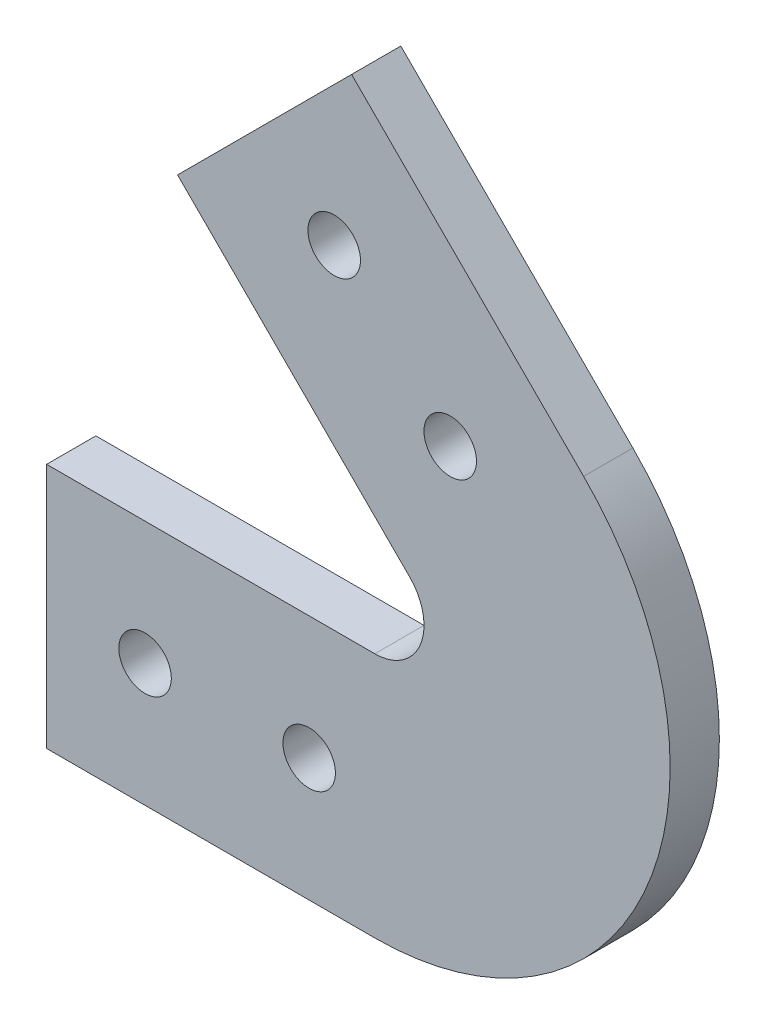
ISO-10303-21;
HEADER;
FILE_DESCRIPTION(('STEP AP214'),'2;1');
FILE_NAME('part.step','',(''),(''),'','','');
FILE_SCHEMA(('AUTOMOTIVE_DESIGN { 1 0 10303 214 1 1 1 1 }'));
ENDSEC;
DATA;
#1=APPLICATION_CONTEXT('core data for automotive mechanical design processes');
#2=APPLICATION_PROTOCOL_DEFINITION('international standard','automotive_design',2000,#1);
#3=PRODUCT_CONTEXT('',#1,'mechanical');
#4=PRODUCT('Part','Part','',(#3));
#5=PRODUCT_RELATED_PRODUCT_CATEGORY('part','',(#4));
#6=PRODUCT_DEFINITION_FORMATION('','',#4);
#7=PRODUCT_DEFINITION_CONTEXT('part definition',#1,'design');
#8=PRODUCT_DEFINITION('design','',#6,#7);
#9=PRODUCT_DEFINITION_SHAPE('','',#8);
#10=(LENGTH_UNIT() NAMED_UNIT(*) SI_UNIT(.MILLI.,.METRE.));
#11=(NAMED_UNIT(*) PLANE_ANGLE_UNIT() SI_UNIT($,.RADIAN.));
#12=(NAMED_UNIT(*) SI_UNIT($,.STERADIAN.) SOLID_ANGLE_UNIT());
#13=UNCERTAINTY_MEASURE_WITH_UNIT(LENGTH_MEASURE(1.E-05),#10,'distance_accuracy_value','');
#14=(GEOMETRIC_REPRESENTATION_CONTEXT(3) GLOBAL_UNCERTAINTY_ASSIGNED_CONTEXT((#13)) GLOBAL_UNIT_ASSIGNED_CONTEXT((#10,
#11,#12)) REPRESENTATION_CONTEXT('',''));
#15=CARTESIAN_POINT('',(0.,0.,0.));
#16=DIRECTION('',(0.,0.,1.));
#17=DIRECTION('',(1.,0.,0.));
#18=AXIS2_PLACEMENT_3D('',#15,#16,#17);
#19=CARTESIAN_POINT('',(134.30722902907,134.30722902907,3.));
#20=DIRECTION('',(0.707106781186548,0.707106781186547,0.));
#21=DIRECTION('',(-0.707106781186547,0.707106781186548,0.));
#22=AXIS2_PLACEMENT_3D('',#19,#20,#21);
#23=PLANE('',#22);
#24=DIRECTION('',(0.707106781186547,-0.707106781186548,0.));
#25=VECTOR('',#24,1.);
#26=CARTESIAN_POINT('',(134.30722902907,134.30722902907,0.));
#27=LINE('',#26,#25);
#28=CARTESIAN_POINT('',(62.11129919814,206.50315886,0.));
#29=VERTEX_POINT('',#28);
#30=CARTESIAN_POINT('',(76.2534348218709,192.361023236269,0.));
#31=VERTEX_POINT('',#30);
#32=EDGE_CURVE('E145',#29,#31,#27,.T.);
#33=ORIENTED_EDGE('',*,*,#32,.T.);
#34=DIRECTION('',(0.,0.,-1.));
#35=VECTOR('',#34,1.);
#36=CARTESIAN_POINT('',(76.2534348218709,192.361023236269,3.));
#37=LINE('',#36,#35);
#38=CARTESIAN_POINT('',(76.2534348218709,192.361023236269,3.));
#39=VERTEX_POINT('',#38);
#40=EDGE_CURVE('E13',#39,#31,#37,.T.);
#41=ORIENTED_EDGE('',*,*,#40,.F.);
#42=DIRECTION('',(0.707106781186547,-0.707106781186548,0.));
#43=VECTOR('',#42,1.);
#44=CARTESIAN_POINT('',(134.30722902907,134.30722902907,3.));
#45=LINE('',#44,#43);
#46=CARTESIAN_POINT('',(62.11129919814,206.50315886,3.));
#47=VERTEX_POINT('',#46);
#48=EDGE_CURVE('E165',#47,#39,#45,.T.);
#49=ORIENTED_EDGE('',*,*,#48,.F.);
#50=DIRECTION('',(0.,0.,-1.));
#51=VECTOR('',#50,1.);
#52=CARTESIAN_POINT('',(62.11129919814,206.50315886,3.));
#53=LINE('',#52,#51);
#54=EDGE_CURVE('E65',#47,#29,#53,.T.);
#55=ORIENTED_EDGE('',*,*,#54,.T.);
#56=EDGE_LOOP('',(#33,#41,#49,#55));
#57=FACE_BOUND('',#56,.T.);
#58=ADVANCED_FACE('F49',(#57),#23,.F.);
#59=CARTESIAN_POINT('',(74.1321144783115,190.239702892709,3.));
#60=DIRECTION('',(0.,0.,-1.));
#61=DIRECTION('',(-1.,0.,0.));
#62=AXIS2_PLACEMENT_3D('',#59,#60,#61);
#63=CYLINDRICAL_SURFACE('',#62,2.99999999999998);
#64=CARTESIAN_POINT('',(74.1321144783115,190.239702892709,0.));
#65=DIRECTION('',(0.,0.,1.));
#66=DIRECTION('',(1.,0.,0.));
#67=AXIS2_PLACEMENT_3D('',#64,#65,#66);
#68=CIRCLE('',#67,2.99999999999998);
#69=CARTESIAN_POINT('',(74.1321144783115,187.239702892709,0.));
#70=VERTEX_POINT('',#69);
#71=EDGE_CURVE('E147',#31,#70,#68,.F.);
#72=ORIENTED_EDGE('',*,*,#71,.T.);
#73=DIRECTION('',(0.,0.,-1.));
#74=VECTOR('',#73,1.);
#75=CARTESIAN_POINT('',(74.1321144783115,187.239702892709,3.));
#76=LINE('',#75,#74);
#77=CARTESIAN_POINT('',(74.1321144783115,187.239702892709,3.));
#78=VERTEX_POINT('',#77);
#79=EDGE_CURVE('E57',#78,#70,#76,.T.);
#80=ORIENTED_EDGE('',*,*,#79,.F.);
#81=CARTESIAN_POINT('',(74.1321144783115,190.239702892709,3.));
#82=DIRECTION('',(0.,0.,1.));
#83=DIRECTION('',(1.,0.,0.));
#84=AXIS2_PLACEMENT_3D('',#81,#82,#83);
#85=CIRCLE('',#84,2.99999999999998);
#86=EDGE_CURVE('E103',#39,#78,#85,.F.);
#87=ORIENTED_EDGE('',*,*,#86,.F.);
#88=ORIENTED_EDGE('',*,*,#40,.T.);
#89=EDGE_LOOP('',(#72,#80,#87,#88));
#90=FACE_BOUND('',#89,.T.);
#91=ADVANCED_FACE('F179',(#90),#63,.F.);
#92=CARTESIAN_POINT('',(-2.59847286594324E-13,187.239702892709,3.));
#93=DIRECTION('',(0.,1.,0.));
#94=DIRECTION('',(-1.,0.,0.));
#95=AXIS2_PLACEMENT_3D('',#92,#93,#94);
#96=PLANE('',#95);
#97=DIRECTION('',(1.,0.,0.));
#98=VECTOR('',#97,1.);
#99=CARTESIAN_POINT('',(-2.59847286594324E-13,187.239702892709,0.));
#100=LINE('',#99,#98);
#101=CARTESIAN_POINT('',(54.1321144783115,187.239702892709,0.));
#102=VERTEX_POINT('',#101);
#103=EDGE_CURVE('E151',#102,#70,#100,.T.);
#104=ORIENTED_EDGE('',*,*,#103,.F.);
#105=DIRECTION('',(0.,0.,-1.));
#106=VECTOR('',#105,1.);
#107=CARTESIAN_POINT('',(54.1321144783115,187.239702892709,3.));
#108=LINE('',#107,#106);
#109=CARTESIAN_POINT('',(54.1321144783115,187.239702892709,3.));
#110=VERTEX_POINT('',#109);
#111=EDGE_CURVE('E172',#110,#102,#108,.T.);
#112=ORIENTED_EDGE('',*,*,#111,.F.);
#113=DIRECTION('',(1.,0.,0.));
#114=VECTOR('',#113,1.);
#115=CARTESIAN_POINT('',(-2.59847286594324E-13,187.239702892709,3.));
#116=LINE('',#115,#114);
#117=EDGE_CURVE('E178',#110,#78,#116,.T.);
#118=ORIENTED_EDGE('',*,*,#117,.T.);
#119=ORIENTED_EDGE('',*,*,#79,.T.);
#120=EDGE_LOOP('',(#104,#112,#118,#119));
#121=FACE_BOUND('',#120,.T.);
#122=ADVANCED_FACE('F176',(#121),#96,.T.);
#123=CARTESIAN_POINT('',(54.1321144783115,0.,3.));
#124=DIRECTION('',(1.,0.,0.));
#125=DIRECTION('',(0.,0.,-1.));
#126=AXIS2_PLACEMENT_3D('',#123,#124,#125);
#127=PLANE('',#126);
#128=DIRECTION('',(0.,-1.,0.));
#129=VECTOR('',#128,1.);
#130=CARTESIAN_POINT('',(54.1321144783115,0.,0.));
#131=LINE('',#130,#129);
#132=CARTESIAN_POINT('',(54.1321144783115,172.239702892709,0.));
#133=VERTEX_POINT('',#132);
#134=EDGE_CURVE('E154',#102,#133,#131,.T.);
#135=ORIENTED_EDGE('',*,*,#134,.T.);
#136=DIRECTION('',(0.,0.,-1.));
#137=VECTOR('',#136,1.);
#138=CARTESIAN_POINT('',(54.1321144783115,172.239702892709,3.));
#139=LINE('',#138,#137);
#140=CARTESIAN_POINT('',(54.1321144783115,172.239702892709,3.));
#141=VERTEX_POINT('',#140);
#142=EDGE_CURVE('E169',#141,#133,#139,.T.);
#143=ORIENTED_EDGE('',*,*,#142,.F.);
#144=DIRECTION('',(0.,-1.,0.));
#145=VECTOR('',#144,1.);
#146=CARTESIAN_POINT('',(54.1321144783115,0.,3.));
#147=LINE('',#146,#145);
#148=EDGE_CURVE('E191',#110,#141,#147,.T.);
#149=ORIENTED_EDGE('',*,*,#148,.F.);
#150=ORIENTED_EDGE('',*,*,#111,.T.);
#151=EDGE_LOOP('',(#135,#143,#149,#150));
#152=FACE_BOUND('',#151,.T.);
#153=ADVANCED_FACE('F187',(#152),#127,.F.);
#154=CARTESIAN_POINT('',(0.,172.239702892709,3.));
#155=DIRECTION('',(0.,1.,0.));
#156=DIRECTION('',(0.,0.,1.));
#157=AXIS2_PLACEMENT_3D('',#154,#155,#156);
#158=PLANE('',#157);
#159=DIRECTION('',(1.,0.,0.));
#160=VECTOR('',#159,1.);
#161=CARTESIAN_POINT('',(0.,172.239702892709,0.));
#162=LINE('',#161,#160);
#163=CARTESIAN_POINT('',(74.1321144783115,172.239702892709,0.));
#164=VERTEX_POINT('',#163);
#165=EDGE_CURVE('E156',#133,#164,#162,.T.);
#166=ORIENTED_EDGE('',*,*,#165,.T.);
#167=DIRECTION('',(0.,0.,-1.));
#168=VECTOR('',#167,1.);
#169=CARTESIAN_POINT('',(74.1321144783115,172.239702892709,3.));
#170=LINE('',#169,#168);
#171=CARTESIAN_POINT('',(74.1321144783115,172.239702892709,3.));
#172=VERTEX_POINT('',#171);
#173=EDGE_CURVE('E128',#172,#164,#170,.T.);
#174=ORIENTED_EDGE('',*,*,#173,.F.);
#175=DIRECTION('',(1.,0.,0.));
#176=VECTOR('',#175,1.);
#177=CARTESIAN_POINT('',(0.,172.239702892709,3.));
#178=LINE('',#177,#176);
#179=EDGE_CURVE('E136',#141,#172,#178,.T.);
#180=ORIENTED_EDGE('',*,*,#179,.F.);
#181=ORIENTED_EDGE('',*,*,#142,.T.);
#182=EDGE_LOOP('',(#166,#174,#180,#181));
#183=FACE_BOUND('',#182,.T.);
#184=ADVANCED_FACE('F190',(#183),#158,.F.);
#185=CARTESIAN_POINT('',(74.1321144783115,190.239702892709,3.));
#186=DIRECTION('',(0.,0.,-1.));
#187=DIRECTION('',(-1.,0.,0.));
#188=AXIS2_PLACEMENT_3D('',#185,#186,#187);
#189=CYLINDRICAL_SURFACE('',#188,18.);
#190=CARTESIAN_POINT('',(74.1321144783115,190.239702892709,0.));
#191=DIRECTION('',(0.,0.,1.));
#192=DIRECTION('',(1.,0.,0.));
#193=AXIS2_PLACEMENT_3D('',#190,#191,#192);
#194=CIRCLE('',#193,18.);
#195=CARTESIAN_POINT('',(86.8600365396693,202.967624954067,0.));
#196=VERTEX_POINT('',#195);
#197=EDGE_CURVE('E124',#196,#164,#194,.F.);
#198=ORIENTED_EDGE('',*,*,#197,.F.);
#199=DIRECTION('',(0.,0.,-1.));
#200=VECTOR('',#199,1.);
#201=CARTESIAN_POINT('',(86.8600365396693,202.967624954067,3.));
#202=LINE('',#201,#200);
#203=CARTESIAN_POINT('',(86.8600365396693,202.967624954067,3.));
#204=VERTEX_POINT('',#203);
#205=EDGE_CURVE('E119',#204,#196,#202,.T.);
#206=ORIENTED_EDGE('',*,*,#205,.F.);
#207=CARTESIAN_POINT('',(74.1321144783115,190.239702892709,3.));
#208=DIRECTION('',(0.,0.,1.));
#209=DIRECTION('',(1.,0.,0.));
#210=AXIS2_PLACEMENT_3D('',#207,#208,#209);
#211=CIRCLE('',#210,18.);
#212=EDGE_CURVE('E122',#204,#172,#211,.F.);
#213=ORIENTED_EDGE('',*,*,#212,.T.);
#214=ORIENTED_EDGE('',*,*,#173,.T.);
#215=EDGE_LOOP('',(#198,#206,#213,#214));
#216=FACE_BOUND('',#215,.T.);
#217=ADVANCED_FACE('F121',(#216),#189,.T.);
#218=CARTESIAN_POINT('',(144.913830746868,144.913830746868,3.));
#219=DIRECTION('',(0.707106781186547,0.707106781186548,0.));
#220=DIRECTION('',(-0.707106781186548,0.707106781186547,0.));
#221=AXIS2_PLACEMENT_3D('',#218,#219,#220);
#222=PLANE('',#221);
#223=DIRECTION('',(0.707106781186548,-0.707106781186547,0.));
#224=VECTOR('',#223,1.);
#225=CARTESIAN_POINT('',(144.913830746868,144.913830746868,0.));
#226=LINE('',#225,#224);
#227=CARTESIAN_POINT('',(72.7179009159382,217.109760577798,0.));
#228=VERTEX_POINT('',#227);
#229=EDGE_CURVE('E160',#228,#196,#226,.T.);
#230=ORIENTED_EDGE('',*,*,#229,.F.);
#231=DIRECTION('',(0.,0.,-1.));
#232=VECTOR('',#231,1.);
#233=CARTESIAN_POINT('',(72.7179009159382,217.109760577798,3.));
#234=LINE('',#233,#232);
#235=CARTESIAN_POINT('',(72.7179009159382,217.109760577798,3.));
#236=VERTEX_POINT('',#235);
#237=EDGE_CURVE('E91',#236,#228,#234,.T.);
#238=ORIENTED_EDGE('',*,*,#237,.F.);
#239=DIRECTION('',(0.707106781186548,-0.707106781186547,0.));
#240=VECTOR('',#239,1.);
#241=CARTESIAN_POINT('',(144.913830746868,144.913830746868,3.));
#242=LINE('',#241,#240);
#243=EDGE_CURVE('E134',#236,#204,#242,.T.);
#244=ORIENTED_EDGE('',*,*,#243,.T.);
#245=ORIENTED_EDGE('',*,*,#205,.T.);
#246=EDGE_LOOP('',(#230,#238,#244,#245));
#247=FACE_BOUND('',#246,.T.);
#248=ADVANCED_FACE('F139',(#247),#222,.T.);
#249=CARTESIAN_POINT('',(-72.19592983093,72.1959298309301,3.));
#250=DIRECTION('',(-0.707106781186547,0.707106781186548,0.));
#251=DIRECTION('',(-0.707106781186548,-0.707106781186547,0.));
#252=AXIS2_PLACEMENT_3D('',#249,#250,#251);
#253=PLANE('',#252);
#254=DIRECTION('',(0.707106781186548,0.707106781186547,0.));
#255=VECTOR('',#254,1.);
#256=CARTESIAN_POINT('',(-72.19592983093,72.1959298309301,0.));
#257=LINE('',#256,#255);
#258=EDGE_CURVE('E162',#29,#228,#257,.T.);
#259=ORIENTED_EDGE('',*,*,#258,.F.);
#260=ORIENTED_EDGE('',*,*,#54,.F.);
#261=DIRECTION('',(0.707106781186548,0.707106781186547,0.));
#262=VECTOR('',#261,1.);
#263=CARTESIAN_POINT('',(-72.19592983093,72.1959298309301,3.));
#264=LINE('',#263,#262);
#265=EDGE_CURVE('E140',#47,#236,#264,.T.);
#266=ORIENTED_EDGE('',*,*,#265,.T.);
#267=ORIENTED_EDGE('',*,*,#237,.T.);
#268=EDGE_LOOP('',(#259,#260,#266,#267));
#269=FACE_BOUND('',#268,.T.);
#270=ADVANCED_FACE('F232',(#269),#253,.T.);
#271=CARTESIAN_POINT('',(0.,0.,3.));
#272=DIRECTION('',(0.,0.,1.));
#273=DIRECTION('',(1.,0.,0.));
#274=AXIS2_PLACEMENT_3D('',#271,#272,#273);
#275=PLANE('',#274);
#276=CARTESIAN_POINT('',(71.6572407441584,207.56381903178,3.));
#277=DIRECTION('',(0.,0.,1.));
#278=DIRECTION('',(1.,0.,0.));
#279=AXIS2_PLACEMENT_3D('',#276,#277,#278);
#280=CIRCLE('',#279,1.6);
#281=CARTESIAN_POINT('',(73.2572407441584,207.56381903178,3.));
#282=VERTEX_POINT('',#281);
#283=EDGE_CURVE('E210',#282,#282,#280,.T.);
#284=ORIENTED_EDGE('',*,*,#283,.F.);
#285=EDGE_LOOP('',(#284));
#286=FACE_BOUND('',#285,.T.);
#287=CARTESIAN_POINT('',(70.1321144783115,179.739702892709,3.));
#288=DIRECTION('',(0.,0.,1.));
#289=DIRECTION('',(1.,0.,0.));
#290=AXIS2_PLACEMENT_3D('',#287,#288,#289);
#291=CIRCLE('',#290,1.6);
#292=CARTESIAN_POINT('',(71.7321144783115,179.739702892709,3.));
#293=VERTEX_POINT('',#292);
#294=EDGE_CURVE('E211',#293,#293,#291,.T.);
#295=ORIENTED_EDGE('',*,*,#294,.F.);
#296=EDGE_LOOP('',(#295));
#297=FACE_BOUND('',#296,.T.);
#298=CARTESIAN_POINT('',(60.1321144783115,179.739702892709,3.));
#299=DIRECTION('',(0.,0.,1.));
#300=DIRECTION('',(1.,0.,0.));
#301=AXIS2_PLACEMENT_3D('',#298,#299,#300);
#302=CIRCLE('',#301,1.6);
#303=CARTESIAN_POINT('',(61.7321144783115,179.739702892709,3.));
#304=VERTEX_POINT('',#303);
#305=EDGE_CURVE('E197',#304,#304,#302,.T.);
#306=ORIENTED_EDGE('',*,*,#305,.F.);
#307=EDGE_LOOP('',(#306));
#308=FACE_BOUND('',#307,.T.);
#309=CARTESIAN_POINT('',(78.7283085560238,200.492751219914,3.));
#310=DIRECTION('',(0.,0.,1.));
#311=DIRECTION('',(1.,0.,0.));
#312=AXIS2_PLACEMENT_3D('',#309,#310,#311);
#313=CIRCLE('',#312,1.6);
#314=CARTESIAN_POINT('',(80.3283085560238,200.492751219914,3.));
#315=VERTEX_POINT('',#314);
#316=EDGE_CURVE('E204',#315,#315,#313,.T.);
#317=ORIENTED_EDGE('',*,*,#316,.F.);
#318=EDGE_LOOP('',(#317));
#319=FACE_BOUND('',#318,.T.);
#320=ORIENTED_EDGE('',*,*,#48,.T.);
#321=ORIENTED_EDGE('',*,*,#86,.T.);
#322=ORIENTED_EDGE('',*,*,#117,.F.);
#323=ORIENTED_EDGE('',*,*,#148,.T.);
#324=ORIENTED_EDGE('',*,*,#179,.T.);
#325=ORIENTED_EDGE('',*,*,#212,.F.);
#326=ORIENTED_EDGE('',*,*,#243,.F.);
#327=ORIENTED_EDGE('',*,*,#265,.F.);
#328=EDGE_LOOP('',(#320,#321,#322,#323,#324,#325,#326,#327));
#329=FACE_BOUND('',#328,.T.);
#330=ADVANCED_FACE('F132',(#286,#297,#308,#319,#329),#275,.T.);
#331=CARTESIAN_POINT('',(0.,0.,0.));
#332=DIRECTION('',(0.,0.,1.));
#333=DIRECTION('',(1.,0.,0.));
#334=AXIS2_PLACEMENT_3D('',#331,#332,#333);
#335=PLANE('',#334);
#336=CARTESIAN_POINT('',(71.6572407441584,207.56381903178,0.));
#337=DIRECTION('',(0.,0.,1.));
#338=DIRECTION('',(1.,0.,0.));
#339=AXIS2_PLACEMENT_3D('',#336,#337,#338);
#340=CIRCLE('',#339,1.6);
#341=CARTESIAN_POINT('',(73.2572407441584,207.56381903178,0.));
#342=VERTEX_POINT('',#341);
#343=EDGE_CURVE('E148',#342,#342,#340,.T.);
#344=ORIENTED_EDGE('',*,*,#343,.T.);
#345=EDGE_LOOP('',(#344));
#346=FACE_BOUND('',#345,.T.);
#347=CARTESIAN_POINT('',(70.1321144783115,179.739702892709,0.));
#348=DIRECTION('',(0.,0.,1.));
#349=DIRECTION('',(1.,0.,0.));
#350=AXIS2_PLACEMENT_3D('',#347,#348,#349);
#351=CIRCLE('',#350,1.6);
#352=CARTESIAN_POINT('',(71.7321144783115,179.739702892709,0.));
#353=VERTEX_POINT('',#352);
#354=EDGE_CURVE('E201',#353,#353,#351,.T.);
#355=ORIENTED_EDGE('',*,*,#354,.T.);
#356=EDGE_LOOP('',(#355));
#357=FACE_BOUND('',#356,.T.);
#358=CARTESIAN_POINT('',(60.1321144783115,179.739702892709,0.));
#359=DIRECTION('',(0.,0.,1.));
#360=DIRECTION('',(1.,0.,0.));
#361=AXIS2_PLACEMENT_3D('',#358,#359,#360);
#362=CIRCLE('',#361,1.6);
#363=CARTESIAN_POINT('',(61.7321144783115,179.739702892709,0.));
#364=VERTEX_POINT('',#363);
#365=EDGE_CURVE('E200',#364,#364,#362,.T.);
#366=ORIENTED_EDGE('',*,*,#365,.T.);
#367=EDGE_LOOP('',(#366));
#368=FACE_BOUND('',#367,.T.);
#369=CARTESIAN_POINT('',(78.7283085560238,200.492751219914,0.));
#370=DIRECTION('',(0.,0.,1.));
#371=DIRECTION('',(1.,0.,0.));
#372=AXIS2_PLACEMENT_3D('',#369,#370,#371);
#373=CIRCLE('',#372,1.6);
#374=CARTESIAN_POINT('',(80.3283085560238,200.492751219914,0.));
#375=VERTEX_POINT('',#374);
#376=EDGE_CURVE('E207',#375,#375,#373,.T.);
#377=ORIENTED_EDGE('',*,*,#376,.T.);
#378=EDGE_LOOP('',(#377));
#379=FACE_BOUND('',#378,.T.);
#380=ORIENTED_EDGE('',*,*,#32,.F.);
#381=ORIENTED_EDGE('',*,*,#258,.T.);
#382=ORIENTED_EDGE('',*,*,#229,.T.);
#383=ORIENTED_EDGE('',*,*,#197,.T.);
#384=ORIENTED_EDGE('',*,*,#165,.F.);
#385=ORIENTED_EDGE('',*,*,#134,.F.);
#386=ORIENTED_EDGE('',*,*,#103,.T.);
#387=ORIENTED_EDGE('',*,*,#71,.F.);
#388=EDGE_LOOP('',(#380,#381,#382,#383,#384,#385,#386,#387));
#389=FACE_BOUND('',#388,.T.);
#390=ADVANCED_FACE('F183',(#346,#357,#368,#379,#389),#335,.F.);
#391=CARTESIAN_POINT('',(78.7283085560238,200.492751219914,0.));
#392=DIRECTION('',(0.,0.,1.));
#393=DIRECTION('',(1.,0.,0.));
#394=AXIS2_PLACEMENT_3D('',#391,#392,#393);
#395=CYLINDRICAL_SURFACE('',#394,1.6);
#396=ORIENTED_EDGE('',*,*,#376,.F.);
#397=EDGE_LOOP('',(#396));
#398=FACE_BOUND('',#397,.T.);
#399=ORIENTED_EDGE('',*,*,#316,.T.);
#400=EDGE_LOOP('',(#399));
#401=FACE_BOUND('',#400,.T.);
#402=ADVANCED_FACE('F240',(#398,#401),#395,.F.);
#403=CARTESIAN_POINT('',(60.1321144783115,179.739702892709,0.));
#404=DIRECTION('',(0.,0.,1.));
#405=DIRECTION('',(1.,0.,0.));
#406=AXIS2_PLACEMENT_3D('',#403,#404,#405);
#407=CYLINDRICAL_SURFACE('',#406,1.6);
#408=ORIENTED_EDGE('',*,*,#365,.F.);
#409=EDGE_LOOP('',(#408));
#410=FACE_BOUND('',#409,.T.);
#411=ORIENTED_EDGE('',*,*,#305,.T.);
#412=EDGE_LOOP('',(#411));
#413=FACE_BOUND('',#412,.T.);
#414=ADVANCED_FACE('F242',(#410,#413),#407,.F.);
#415=CARTESIAN_POINT('',(70.1321144783115,179.739702892709,0.));
#416=DIRECTION('',(0.,0.,1.));
#417=DIRECTION('',(1.,0.,0.));
#418=AXIS2_PLACEMENT_3D('',#415,#416,#417);
#419=CYLINDRICAL_SURFACE('',#418,1.6);
#420=ORIENTED_EDGE('',*,*,#354,.F.);
#421=EDGE_LOOP('',(#420));
#422=FACE_BOUND('',#421,.T.);
#423=ORIENTED_EDGE('',*,*,#294,.T.);
#424=EDGE_LOOP('',(#423));
#425=FACE_BOUND('',#424,.T.);
#426=ADVANCED_FACE('F226',(#422,#425),#419,.F.);
#427=CARTESIAN_POINT('',(71.6572407441584,207.56381903178,0.));
#428=DIRECTION('',(0.,0.,1.));
#429=DIRECTION('',(1.,0.,0.));
#430=AXIS2_PLACEMENT_3D('',#427,#428,#429);
#431=CYLINDRICAL_SURFACE('',#430,1.6);
#432=ORIENTED_EDGE('',*,*,#343,.F.);
#433=EDGE_LOOP('',(#432));
#434=FACE_BOUND('',#433,.T.);
#435=ORIENTED_EDGE('',*,*,#283,.T.);
#436=EDGE_LOOP('',(#435));
#437=FACE_BOUND('',#436,.T.);
#438=ADVANCED_FACE('F223',(#434,#437),#431,.F.);
#439=CLOSED_SHELL('',(#58,#91,#122,#153,#184,#217,#248,#270,#330,#390,#402,#414,#426,#438));
#440=MANIFOLD_SOLID_BREP('B2',#439);
#441=ADVANCED_BREP_SHAPE_REPRESENTATION('',(#18,#440),#14);
#442=SHAPE_DEFINITION_REPRESENTATION(#9,#441);
ENDSEC;
END-ISO-10303-21;
